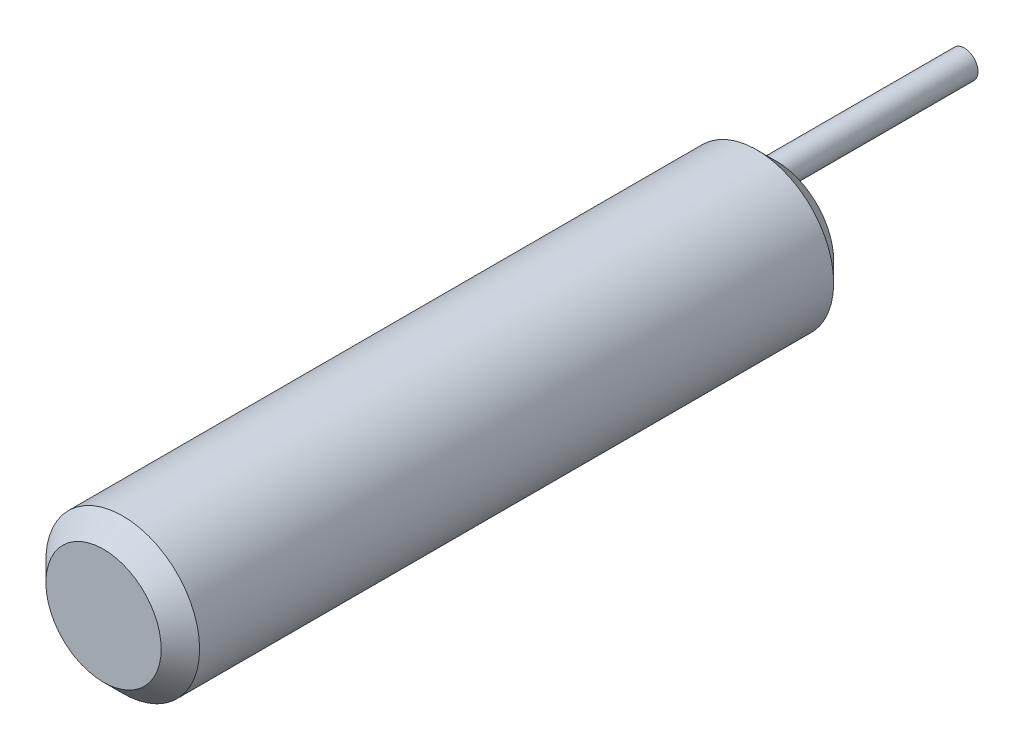
ISO-10303-21;
HEADER;
FILE_DESCRIPTION(('STEP AP214'),'2;1');
FILE_NAME('part.step','',(''),(''),'','','');
FILE_SCHEMA(('AUTOMOTIVE_DESIGN { 1 0 10303 214 1 1 1 1 }'));
ENDSEC;
DATA;
#1=APPLICATION_CONTEXT('core data for automotive mechanical design processes');
#2=APPLICATION_PROTOCOL_DEFINITION('international standard','automotive_design',2000,#1);
#3=PRODUCT_CONTEXT('',#1,'mechanical');
#4=PRODUCT('Part','Part','',(#3));
#5=PRODUCT_RELATED_PRODUCT_CATEGORY('part','',(#4));
#6=PRODUCT_DEFINITION_FORMATION('','',#4);
#7=PRODUCT_DEFINITION_CONTEXT('part definition',#1,'design');
#8=PRODUCT_DEFINITION('design','',#6,#7);
#9=PRODUCT_DEFINITION_SHAPE('','',#8);
#10=(LENGTH_UNIT() NAMED_UNIT(*) SI_UNIT(.MILLI.,.METRE.));
#11=(NAMED_UNIT(*) PLANE_ANGLE_UNIT() SI_UNIT($,.RADIAN.));
#12=(NAMED_UNIT(*) SI_UNIT($,.STERADIAN.) SOLID_ANGLE_UNIT());
#13=UNCERTAINTY_MEASURE_WITH_UNIT(LENGTH_MEASURE(1.E-05),#10,'distance_accuracy_value','');
#14=(GEOMETRIC_REPRESENTATION_CONTEXT(3) GLOBAL_UNCERTAINTY_ASSIGNED_CONTEXT((#13)) GLOBAL_UNIT_ASSIGNED_CONTEXT((#10,
#11,#12)) REPRESENTATION_CONTEXT('',''));
#15=CARTESIAN_POINT('',(0.,0.,0.));
#16=DIRECTION('',(0.,0.,1.));
#17=DIRECTION('',(1.,0.,0.));
#18=AXIS2_PLACEMENT_3D('',#15,#16,#17);
#19=CARTESIAN_POINT('',(0.,0.,0.));
#20=DIRECTION('',(0.,0.,1.));
#21=DIRECTION('',(1.,0.,0.));
#22=AXIS2_PLACEMENT_3D('',#19,#20,#21);
#23=PLANE('',#22);
#24=CARTESIAN_POINT('',(0.,0.,0.));
#25=DIRECTION('',(0.,0.,1.));
#26=DIRECTION('',(1.,0.,0.));
#27=AXIS2_PLACEMENT_3D('',#24,#25,#26);
#28=CIRCLE('',#27,3.);
#29=CARTESIAN_POINT('',(-0.262676540287967,2.98847804662881,0.));
#30=VERTEX_POINT('',#29);
#31=EDGE_CURVE('E43',#30,#30,#28,.F.);
#32=ORIENTED_EDGE('',*,*,#31,.T.);
#33=CARTESIAN_POINT('',(-0.200233264504433,2.27805922264817,0.));
#34=DIRECTION('',(0.,0.,-1.));
#35=DIRECTION('',(-1.,0.,0.));
#36=AXIS2_PLACEMENT_3D('',#33,#34,#35);
#37=CIRCLE('',#36,0.713157814341685);
#38=EDGE_CURVE('E59',#30,#30,#37,.T.);
#39=ORIENTED_EDGE('',*,*,#38,.F.);
#40=EDGE_LOOP('',(#32,#39));
#41=FACE_BOUND('',#40,.T.);
#42=ADVANCED_FACE('F36',(#41),#23,.F.);
#43=CARTESIAN_POINT('',(0.,0.,35.));
#44=DIRECTION('',(0.,0.,-1.));
#45=DIRECTION('',(-1.,0.,0.));
#46=AXIS2_PLACEMENT_3D('',#43,#44,#45);
#47=CYLINDRICAL_SURFACE('',#46,4.);
#48=CARTESIAN_POINT('',(0.,0.,1.));
#49=DIRECTION('',(0.,0.,1.));
#50=DIRECTION('',(1.,0.,0.));
#51=AXIS2_PLACEMENT_3D('',#48,#49,#50);
#52=CIRCLE('',#51,4.);
#53=CARTESIAN_POINT('',(4.,0.,1.));
#54=VERTEX_POINT('',#53);
#55=EDGE_CURVE('E51',#54,#54,#52,.T.);
#56=ORIENTED_EDGE('',*,*,#55,.T.);
#57=EDGE_LOOP('',(#56));
#58=FACE_BOUND('',#57,.T.);
#59=CARTESIAN_POINT('',(0.,0.,34.));
#60=DIRECTION('',(0.,0.,1.));
#61=DIRECTION('',(1.,0.,0.));
#62=AXIS2_PLACEMENT_3D('',#59,#60,#61);
#63=CIRCLE('',#62,4.);
#64=CARTESIAN_POINT('',(4.,0.,34.));
#65=VERTEX_POINT('',#64);
#66=EDGE_CURVE('E53',#65,#65,#63,.F.);
#67=ORIENTED_EDGE('',*,*,#66,.T.);
#68=EDGE_LOOP('',(#67));
#69=FACE_BOUND('',#68,.T.);
#70=ADVANCED_FACE('F72',(#58,#69),#47,.T.);
#71=CARTESIAN_POINT('',(0.,0.,35.));
#72=DIRECTION('',(0.,0.,1.));
#73=DIRECTION('',(1.,0.,0.));
#74=AXIS2_PLACEMENT_3D('',#71,#72,#73);
#75=PLANE('',#74);
#76=CARTESIAN_POINT('',(0.,0.,35.));
#77=DIRECTION('',(0.,0.,1.));
#78=DIRECTION('',(1.,0.,0.));
#79=AXIS2_PLACEMENT_3D('',#76,#77,#78);
#80=CIRCLE('',#79,2.99999999999999);
#81=CARTESIAN_POINT('',(2.99999999999999,0.,35.));
#82=VERTEX_POINT('',#81);
#83=EDGE_CURVE('E11',#82,#82,#80,.T.);
#84=ORIENTED_EDGE('',*,*,#83,.T.);
#85=EDGE_LOOP('',(#84));
#86=FACE_BOUND('',#85,.T.);
#87=ADVANCED_FACE('F77',(#86),#75,.T.);
#88=CARTESIAN_POINT('',(0.,0.,1.));
#89=DIRECTION('',(0.,0.,1.));
#90=DIRECTION('',(1.,0.,0.));
#91=AXIS2_PLACEMENT_3D('',#88,#89,#90);
#92=CONICAL_SURFACE('',#91,4.,0.785398163397448);
#93=ORIENTED_EDGE('',*,*,#31,.F.);
#94=EDGE_LOOP('',(#93));
#95=FACE_BOUND('',#94,.T.);
#96=ORIENTED_EDGE('',*,*,#55,.F.);
#97=EDGE_LOOP('',(#96));
#98=FACE_BOUND('',#97,.T.);
#99=ADVANCED_FACE('F47',(#95,#98),#92,.T.);
#100=CARTESIAN_POINT('',(0.,0.,35.));
#101=DIRECTION('',(0.,0.,-1.));
#102=DIRECTION('',(-1.,0.,0.));
#103=AXIS2_PLACEMENT_3D('',#100,#101,#102);
#104=CONICAL_SURFACE('',#103,2.99999999999999,0.785398163397448);
#105=ORIENTED_EDGE('',*,*,#66,.F.);
#106=EDGE_LOOP('',(#105));
#107=FACE_BOUND('',#106,.T.);
#108=ORIENTED_EDGE('',*,*,#83,.F.);
#109=EDGE_LOOP('',(#108));
#110=FACE_BOUND('',#109,.T.);
#111=ADVANCED_FACE('F38',(#107,#110),#104,.T.);
#112=CARTESIAN_POINT('',(-0.200233264504433,2.27805922264817,-10.));
#113=DIRECTION('',(0.,0.,1.));
#114=DIRECTION('',(1.,0.,0.));
#115=AXIS2_PLACEMENT_3D('',#112,#113,#114);
#116=CYLINDRICAL_SURFACE('',#115,0.713157814341685);
#117=CARTESIAN_POINT('',(-0.200233264504433,2.27805922264817,-10.));
#118=DIRECTION('',(0.,0.,-1.));
#119=DIRECTION('',(-1.,0.,0.));
#120=AXIS2_PLACEMENT_3D('',#117,#118,#119);
#121=CIRCLE('',#120,0.713157814341685);
#122=CARTESIAN_POINT('',(-0.913391078846118,2.27805922264817,-10.));
#123=VERTEX_POINT('',#122);
#124=EDGE_CURVE('E58',#123,#123,#121,.T.);
#125=ORIENTED_EDGE('',*,*,#124,.F.);
#126=EDGE_LOOP('',(#125));
#127=FACE_BOUND('',#126,.T.);
#128=ORIENTED_EDGE('',*,*,#38,.T.);
#129=EDGE_LOOP('',(#128));
#130=FACE_BOUND('',#129,.T.);
#131=ADVANCED_FACE('F67',(#127,#130),#116,.T.);
#132=CARTESIAN_POINT('',(-0.200233264504433,2.27805922264817,-10.));
#133=DIRECTION('',(0.,0.,-1.));
#134=DIRECTION('',(-1.,0.,0.));
#135=AXIS2_PLACEMENT_3D('',#132,#133,#134);
#136=PLANE('',#135);
#137=ORIENTED_EDGE('',*,*,#124,.T.);
#138=EDGE_LOOP('',(#137));
#139=FACE_BOUND('',#138,.T.);
#140=ADVANCED_FACE('F65',(#139),#136,.T.);
#141=CLOSED_SHELL('',(#42,#70,#87,#99,#111,#131,#140));
#142=MANIFOLD_SOLID_BREP('B2',#141);
#143=ADVANCED_BREP_SHAPE_REPRESENTATION('',(#18,#142),#14);
#144=SHAPE_DEFINITION_REPRESENTATION(#9,#143);
ENDSEC;
END-ISO-10303-21;
